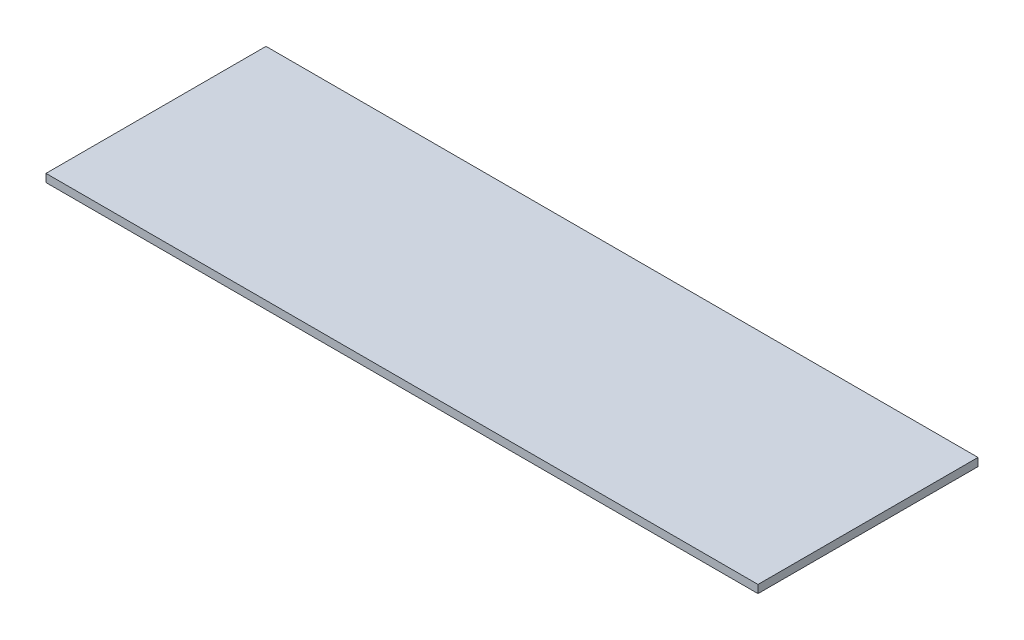
ISO-10303-21;
HEADER;
FILE_DESCRIPTION(('STEP AP214'),'2;1');
FILE_NAME('part.step','',(''),(''),'','','');
FILE_SCHEMA(('AUTOMOTIVE_DESIGN { 1 0 10303 214 1 1 1 1 }'));
ENDSEC;
DATA;
#1=APPLICATION_CONTEXT('core data for automotive mechanical design processes');
#2=APPLICATION_PROTOCOL_DEFINITION('international standard','automotive_design',2000,#1);
#3=PRODUCT_CONTEXT('',#1,'mechanical');
#4=PRODUCT('Part','Part','',(#3));
#5=PRODUCT_RELATED_PRODUCT_CATEGORY('part','',(#4));
#6=PRODUCT_DEFINITION_FORMATION('','',#4);
#7=PRODUCT_DEFINITION_CONTEXT('part definition',#1,'design');
#8=PRODUCT_DEFINITION('design','',#6,#7);
#9=PRODUCT_DEFINITION_SHAPE('','',#8);
#10=(LENGTH_UNIT() NAMED_UNIT(*) SI_UNIT(.MILLI.,.METRE.));
#11=(NAMED_UNIT(*) PLANE_ANGLE_UNIT() SI_UNIT($,.RADIAN.));
#12=(NAMED_UNIT(*) SI_UNIT($,.STERADIAN.) SOLID_ANGLE_UNIT());
#13=UNCERTAINTY_MEASURE_WITH_UNIT(LENGTH_MEASURE(1.E-05),#10,'distance_accuracy_value','');
#14=(GEOMETRIC_REPRESENTATION_CONTEXT(3) GLOBAL_UNCERTAINTY_ASSIGNED_CONTEXT((#13)) GLOBAL_UNIT_ASSIGNED_CONTEXT((#10,
#11,#12)) REPRESENTATION_CONTEXT('',''));
#15=CARTESIAN_POINT('',(0.,0.,0.));
#16=DIRECTION('',(0.,0.,1.));
#17=DIRECTION('',(1.,0.,0.));
#18=AXIS2_PLACEMENT_3D('',#15,#16,#17);
#19=CARTESIAN_POINT('',(89.,2.,27.5));
#20=DIRECTION('',(-1.,0.,0.));
#21=DIRECTION('',(0.,0.,1.));
#22=AXIS2_PLACEMENT_3D('',#19,#20,#21);
#23=PLANE('',#22);
#24=DIRECTION('',(0.,0.,-1.));
#25=VECTOR('',#24,1.);
#26=CARTESIAN_POINT('',(89.,0.,27.5));
#27=LINE('',#26,#25);
#28=CARTESIAN_POINT('',(89.,0.,27.5));
#29=VERTEX_POINT('',#28);
#30=CARTESIAN_POINT('',(89.,0.,-27.5));
#31=VERTEX_POINT('',#30);
#32=EDGE_CURVE('E111',#29,#31,#27,.T.);
#33=ORIENTED_EDGE('',*,*,#32,.T.);
#34=DIRECTION('',(0.,-1.,0.));
#35=VECTOR('',#34,1.);
#36=CARTESIAN_POINT('',(89.,2.,-27.5));
#37=LINE('',#36,#35);
#38=CARTESIAN_POINT('',(89.,2.,-27.5));
#39=VERTEX_POINT('',#38);
#40=EDGE_CURVE('E11',#39,#31,#37,.T.);
#41=ORIENTED_EDGE('',*,*,#40,.F.);
#42=DIRECTION('',(0.,0.,-1.));
#43=VECTOR('',#42,1.);
#44=CARTESIAN_POINT('',(89.,2.,27.5));
#45=LINE('',#44,#43);
#46=CARTESIAN_POINT('',(89.,2.,27.5));
#47=VERTEX_POINT('',#46);
#48=EDGE_CURVE('E94',#47,#39,#45,.T.);
#49=ORIENTED_EDGE('',*,*,#48,.F.);
#50=DIRECTION('',(0.,-1.,0.));
#51=VECTOR('',#50,1.);
#52=CARTESIAN_POINT('',(89.,2.,27.5));
#53=LINE('',#52,#51);
#54=EDGE_CURVE('E107',#47,#29,#53,.T.);
#55=ORIENTED_EDGE('',*,*,#54,.T.);
#56=EDGE_LOOP('',(#33,#41,#49,#55));
#57=FACE_BOUND('',#56,.T.);
#58=ADVANCED_FACE('F42',(#57),#23,.F.);
#59=CARTESIAN_POINT('',(-89.,2.,-27.5));
#60=DIRECTION('',(0.,0.,1.));
#61=DIRECTION('',(1.,0.,0.));
#62=AXIS2_PLACEMENT_3D('',#59,#60,#61);
#63=PLANE('',#62);
#64=DIRECTION('',(-1.,0.,0.));
#65=VECTOR('',#64,1.);
#66=CARTESIAN_POINT('',(-89.,0.,-27.5));
#67=LINE('',#66,#65);
#68=CARTESIAN_POINT('',(-89.,0.,-27.5));
#69=VERTEX_POINT('',#68);
#70=EDGE_CURVE('E99',#31,#69,#67,.T.);
#71=ORIENTED_EDGE('',*,*,#70,.T.);
#72=DIRECTION('',(0.,-1.,0.));
#73=VECTOR('',#72,1.);
#74=CARTESIAN_POINT('',(-89.,2.,-27.5));
#75=LINE('',#74,#73);
#76=CARTESIAN_POINT('',(-89.,2.,-27.5));
#77=VERTEX_POINT('',#76);
#78=EDGE_CURVE('E51',#77,#69,#75,.T.);
#79=ORIENTED_EDGE('',*,*,#78,.F.);
#80=DIRECTION('',(-1.,0.,0.));
#81=VECTOR('',#80,1.);
#82=CARTESIAN_POINT('',(-89.,2.,-27.5));
#83=LINE('',#82,#81);
#84=EDGE_CURVE('E89',#39,#77,#83,.T.);
#85=ORIENTED_EDGE('',*,*,#84,.F.);
#86=ORIENTED_EDGE('',*,*,#40,.T.);
#87=EDGE_LOOP('',(#71,#79,#85,#86));
#88=FACE_BOUND('',#87,.T.);
#89=ADVANCED_FACE('F98',(#88),#63,.F.);
#90=CARTESIAN_POINT('',(-89.,2.,27.5));
#91=DIRECTION('',(1.,0.,0.));
#92=DIRECTION('',(0.,0.,-1.));
#93=AXIS2_PLACEMENT_3D('',#90,#91,#92);
#94=PLANE('',#93);
#95=DIRECTION('',(0.,0.,1.));
#96=VECTOR('',#95,1.);
#97=CARTESIAN_POINT('',(-89.,0.,27.5));
#98=LINE('',#97,#96);
#99=CARTESIAN_POINT('',(-89.,0.,27.5));
#100=VERTEX_POINT('',#99);
#101=EDGE_CURVE('E76',#69,#100,#98,.T.);
#102=ORIENTED_EDGE('',*,*,#101,.T.);
#103=DIRECTION('',(0.,-1.,0.));
#104=VECTOR('',#103,1.);
#105=CARTESIAN_POINT('',(-89.,2.,27.5));
#106=LINE('',#105,#104);
#107=CARTESIAN_POINT('',(-89.,2.,27.5));
#108=VERTEX_POINT('',#107);
#109=EDGE_CURVE('E101',#108,#100,#106,.T.);
#110=ORIENTED_EDGE('',*,*,#109,.F.);
#111=DIRECTION('',(0.,0.,1.));
#112=VECTOR('',#111,1.);
#113=CARTESIAN_POINT('',(-89.,2.,27.5));
#114=LINE('',#113,#112);
#115=EDGE_CURVE('E92',#77,#108,#114,.T.);
#116=ORIENTED_EDGE('',*,*,#115,.F.);
#117=ORIENTED_EDGE('',*,*,#78,.T.);
#118=EDGE_LOOP('',(#102,#110,#116,#117));
#119=FACE_BOUND('',#118,.T.);
#120=ADVANCED_FACE('F102',(#119),#94,.F.);
#121=CARTESIAN_POINT('',(-89.,2.,27.5));
#122=DIRECTION('',(0.,0.,-1.));
#123=DIRECTION('',(-1.,0.,0.));
#124=AXIS2_PLACEMENT_3D('',#121,#122,#123);
#125=PLANE('',#124);
#126=DIRECTION('',(1.,0.,0.));
#127=VECTOR('',#126,1.);
#128=CARTESIAN_POINT('',(-89.,0.,27.5));
#129=LINE('',#128,#127);
#130=EDGE_CURVE('E82',#100,#29,#129,.T.);
#131=ORIENTED_EDGE('',*,*,#130,.T.);
#132=ORIENTED_EDGE('',*,*,#54,.F.);
#133=DIRECTION('',(1.,0.,0.));
#134=VECTOR('',#133,1.);
#135=CARTESIAN_POINT('',(-89.,2.,27.5));
#136=LINE('',#135,#134);
#137=EDGE_CURVE('E59',#108,#47,#136,.T.);
#138=ORIENTED_EDGE('',*,*,#137,.F.);
#139=ORIENTED_EDGE('',*,*,#109,.T.);
#140=EDGE_LOOP('',(#131,#132,#138,#139));
#141=FACE_BOUND('',#140,.T.);
#142=ADVANCED_FACE('F125',(#141),#125,.F.);
#143=CARTESIAN_POINT('',(0.,2.,0.));
#144=DIRECTION('',(0.,-1.,0.));
#145=DIRECTION('',(0.,0.,-1.));
#146=AXIS2_PLACEMENT_3D('',#143,#144,#145);
#147=PLANE('',#146);
#148=ORIENTED_EDGE('',*,*,#48,.T.);
#149=ORIENTED_EDGE('',*,*,#84,.T.);
#150=ORIENTED_EDGE('',*,*,#115,.T.);
#151=ORIENTED_EDGE('',*,*,#137,.T.);
#152=EDGE_LOOP('',(#148,#149,#150,#151));
#153=FACE_BOUND('',#152,.T.);
#154=ADVANCED_FACE('F90',(#153),#147,.F.);
#155=CARTESIAN_POINT('',(0.,0.,0.));
#156=DIRECTION('',(0.,-1.,0.));
#157=DIRECTION('',(0.,0.,-1.));
#158=AXIS2_PLACEMENT_3D('',#155,#156,#157);
#159=PLANE('',#158);
#160=ORIENTED_EDGE('',*,*,#32,.F.);
#161=ORIENTED_EDGE('',*,*,#130,.F.);
#162=ORIENTED_EDGE('',*,*,#101,.F.);
#163=ORIENTED_EDGE('',*,*,#70,.F.);
#164=EDGE_LOOP('',(#160,#161,#162,#163));
#165=FACE_BOUND('',#164,.T.);
#166=ADVANCED_FACE('F128',(#165),#159,.T.);
#167=CLOSED_SHELL('',(#58,#89,#120,#142,#154,#166));
#168=MANIFOLD_SOLID_BREP('B2',#167);
#169=ADVANCED_BREP_SHAPE_REPRESENTATION('',(#18,#168),#14);
#170=SHAPE_DEFINITION_REPRESENTATION(#9,#169);
ENDSEC;
END-ISO-10303-21;
